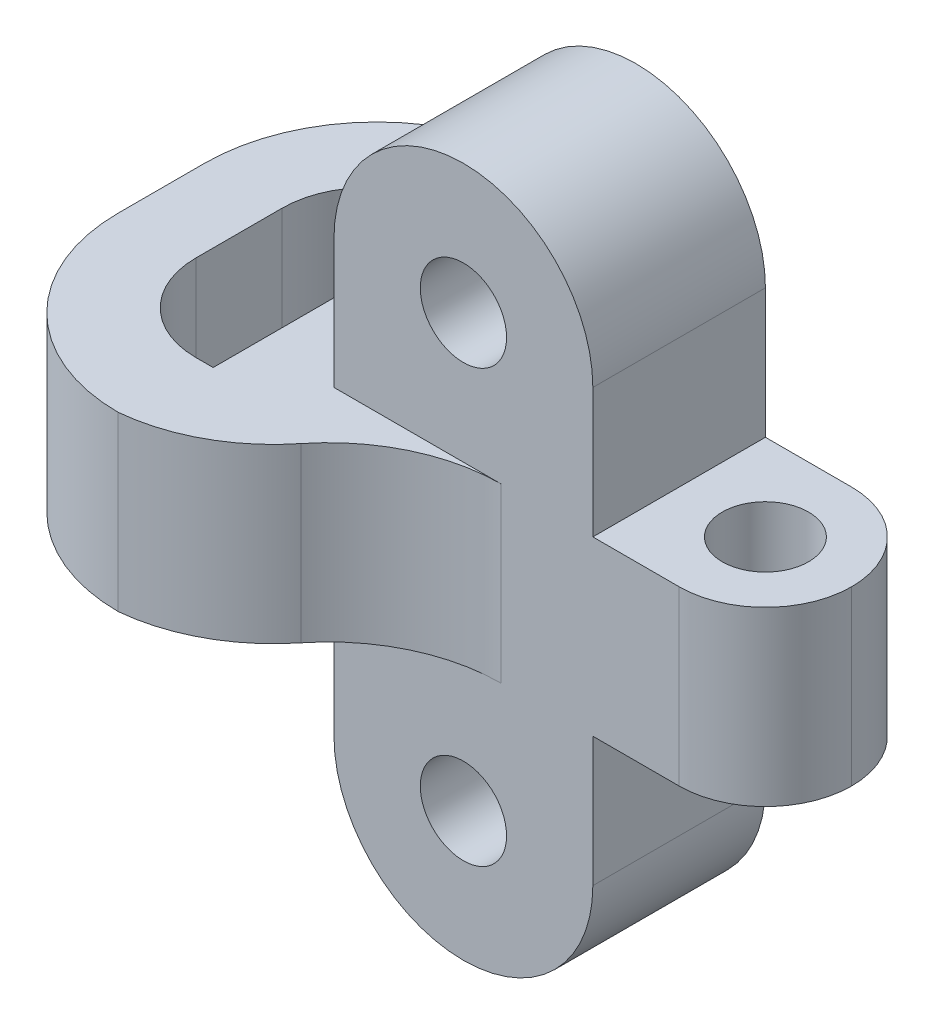
ISO-10303-21;
HEADER;
FILE_DESCRIPTION(('STEP AP214'),'2;1');
FILE_NAME('part.step','',(''),(''),'','','');
FILE_SCHEMA(('AUTOMOTIVE_DESIGN { 1 0 10303 214 1 1 1 1 }'));
ENDSEC;
DATA;
#1=APPLICATION_CONTEXT('core data for automotive mechanical design processes');
#2=APPLICATION_PROTOCOL_DEFINITION('international standard','automotive_design',2000,#1);
#3=PRODUCT_CONTEXT('',#1,'mechanical');
#4=PRODUCT('Part','Part','',(#3));
#5=PRODUCT_RELATED_PRODUCT_CATEGORY('part','',(#4));
#6=PRODUCT_DEFINITION_FORMATION('','',#4);
#7=PRODUCT_DEFINITION_CONTEXT('part definition',#1,'design');
#8=PRODUCT_DEFINITION('design','',#6,#7);
#9=PRODUCT_DEFINITION_SHAPE('','',#8);
#10=(LENGTH_UNIT() NAMED_UNIT(*) SI_UNIT(.MILLI.,.METRE.));
#11=(NAMED_UNIT(*) PLANE_ANGLE_UNIT() SI_UNIT($,.RADIAN.));
#12=(NAMED_UNIT(*) SI_UNIT($,.STERADIAN.) SOLID_ANGLE_UNIT());
#13=UNCERTAINTY_MEASURE_WITH_UNIT(LENGTH_MEASURE(1.E-05),#10,'distance_accuracy_value','');
#14=(GEOMETRIC_REPRESENTATION_CONTEXT(3) GLOBAL_UNCERTAINTY_ASSIGNED_CONTEXT((#13)) GLOBAL_UNIT_ASSIGNED_CONTEXT((#10,
#11,#12)) REPRESENTATION_CONTEXT('',''));
#15=CARTESIAN_POINT('',(0.,0.,0.));
#16=DIRECTION('',(0.,0.,1.));
#17=DIRECTION('',(1.,0.,0.));
#18=AXIS2_PLACEMENT_3D('',#15,#16,#17);
#19=CARTESIAN_POINT('',(7.5,0.,5.));
#20=DIRECTION('',(1.,0.,0.));
#21=DIRECTION('',(0.,0.,-1.));
#22=AXIS2_PLACEMENT_3D('',#19,#20,#21);
#23=PLANE('',#22);
#24=DIRECTION('',(0.,-1.,0.));
#25=VECTOR('',#24,1.);
#26=CARTESIAN_POINT('',(7.5,0.,5.));
#27=LINE('',#26,#25);
#28=CARTESIAN_POINT('',(7.5,25.,5.));
#29=VERTEX_POINT('',#28);
#30=CARTESIAN_POINT('',(7.5,17.5,5.));
#31=VERTEX_POINT('',#30);
#32=EDGE_CURVE('E226',#29,#31,#27,.T.);
#33=ORIENTED_EDGE('',*,*,#32,.T.);
#34=DIRECTION('',(0.,0.,1.));
#35=VECTOR('',#34,1.);
#36=CARTESIAN_POINT('',(7.5,17.5,5.));
#37=LINE('',#36,#35);
#38=CARTESIAN_POINT('',(7.5,17.5,-5.));
#39=VERTEX_POINT('',#38);
#40=EDGE_CURVE('E210',#39,#31,#37,.T.);
#41=ORIENTED_EDGE('',*,*,#40,.F.);
#42=DIRECTION('',(0.,-1.,0.));
#43=VECTOR('',#42,1.);
#44=CARTESIAN_POINT('',(7.5,0.,-5.));
#45=LINE('',#44,#43);
#46=CARTESIAN_POINT('',(7.5,25.,-5.));
#47=VERTEX_POINT('',#46);
#48=EDGE_CURVE('E224',#47,#39,#45,.T.);
#49=ORIENTED_EDGE('',*,*,#48,.F.);
#50=DIRECTION('',(0.,0.,-1.));
#51=VECTOR('',#50,1.);
#52=CARTESIAN_POINT('',(7.5,25.,5.));
#53=LINE('',#52,#51);
#54=EDGE_CURVE('E276',#29,#47,#53,.T.);
#55=ORIENTED_EDGE('',*,*,#54,.F.);
#56=EDGE_LOOP('',(#33,#41,#49,#55));
#57=FACE_BOUND('',#56,.T.);
#58=ADVANCED_FACE('F41',(#57),#23,.T.);
#59=CARTESIAN_POINT('',(7.5,7.5,-5.));
#60=VERTEX_POINT('',#59);
#61=CARTESIAN_POINT('',(7.5,0.,-5.));
#62=VERTEX_POINT('',#61);
#63=EDGE_CURVE('E236',#60,#62,#45,.T.);
#64=ORIENTED_EDGE('',*,*,#63,.F.);
#65=DIRECTION('',(0.,0.,-1.));
#66=VECTOR('',#65,1.);
#67=CARTESIAN_POINT('',(7.5,7.5,5.));
#68=LINE('',#67,#66);
#69=CARTESIAN_POINT('',(7.5,7.5,5.));
#70=VERTEX_POINT('',#69);
#71=EDGE_CURVE('E228',#70,#60,#68,.T.);
#72=ORIENTED_EDGE('',*,*,#71,.F.);
#73=CARTESIAN_POINT('',(7.5,0.,5.));
#74=VERTEX_POINT('',#73);
#75=EDGE_CURVE('E263',#70,#74,#27,.T.);
#76=ORIENTED_EDGE('',*,*,#75,.T.);
#77=DIRECTION('',(0.,0.,-1.));
#78=VECTOR('',#77,1.);
#79=CARTESIAN_POINT('',(7.5,0.,5.));
#80=LINE('',#79,#78);
#81=EDGE_CURVE('E264',#74,#62,#80,.T.);
#82=ORIENTED_EDGE('',*,*,#81,.T.);
#83=EDGE_LOOP('',(#64,#72,#76,#82));
#84=FACE_BOUND('',#83,.T.);
#85=ADVANCED_FACE('F455',(#84),#23,.T.);
#86=CARTESIAN_POINT('',(-7.5,0.,5.));
#87=DIRECTION('',(1.,0.,0.));
#88=DIRECTION('',(0.,0.,-1.));
#89=AXIS2_PLACEMENT_3D('',#86,#87,#88);
#90=PLANE('',#89);
#91=DIRECTION('',(0.,0.,-1.));
#92=VECTOR('',#91,1.);
#93=CARTESIAN_POINT('',(-7.5,17.5,-12.5));
#94=LINE('',#93,#92);
#95=CARTESIAN_POINT('',(-7.5,17.5,5.));
#96=VERTEX_POINT('',#95);
#97=CARTESIAN_POINT('',(-7.5,17.5,-5.));
#98=VERTEX_POINT('',#97);
#99=EDGE_CURVE('E464',#96,#98,#94,.T.);
#100=ORIENTED_EDGE('',*,*,#99,.F.);
#101=DIRECTION('',(0.,-1.,0.));
#102=VECTOR('',#101,1.);
#103=CARTESIAN_POINT('',(-7.5,0.,5.));
#104=LINE('',#103,#102);
#105=CARTESIAN_POINT('',(-7.5,25.,5.));
#106=VERTEX_POINT('',#105);
#107=EDGE_CURVE('E424',#106,#96,#104,.T.);
#108=ORIENTED_EDGE('',*,*,#107,.F.);
#109=DIRECTION('',(0.,0.,-1.));
#110=VECTOR('',#109,1.);
#111=CARTESIAN_POINT('',(-7.5,25.,5.));
#112=LINE('',#111,#110);
#113=CARTESIAN_POINT('',(-7.5,25.,-5.));
#114=VERTEX_POINT('',#113);
#115=EDGE_CURVE('E272',#106,#114,#112,.T.);
#116=ORIENTED_EDGE('',*,*,#115,.T.);
#117=DIRECTION('',(0.,-1.,0.));
#118=VECTOR('',#117,1.);
#119=CARTESIAN_POINT('',(-7.5,0.,-5.));
#120=LINE('',#119,#118);
#121=EDGE_CURVE('E247',#114,#98,#120,.T.);
#122=ORIENTED_EDGE('',*,*,#121,.T.);
#123=EDGE_LOOP('',(#100,#108,#116,#122));
#124=FACE_BOUND('',#123,.T.);
#125=ADVANCED_FACE('F540',(#124),#90,.F.);
#126=DIRECTION('',(0.,0.,1.));
#127=VECTOR('',#126,1.);
#128=CARTESIAN_POINT('',(-7.5,7.5,-12.5));
#129=LINE('',#128,#127);
#130=CARTESIAN_POINT('',(-7.5,7.5,-5.));
#131=VERTEX_POINT('',#130);
#132=CARTESIAN_POINT('',(-7.5,7.5,5.));
#133=VERTEX_POINT('',#132);
#134=EDGE_CURVE('E445',#131,#133,#129,.T.);
#135=ORIENTED_EDGE('',*,*,#134,.F.);
#136=CARTESIAN_POINT('',(-7.5,0.,-5.));
#137=VERTEX_POINT('',#136);
#138=EDGE_CURVE('E240',#131,#137,#120,.T.);
#139=ORIENTED_EDGE('',*,*,#138,.T.);
#140=DIRECTION('',(0.,0.,-1.));
#141=VECTOR('',#140,1.);
#142=CARTESIAN_POINT('',(-7.5,0.,5.));
#143=LINE('',#142,#141);
#144=CARTESIAN_POINT('',(-7.5,0.,5.));
#145=VERTEX_POINT('',#144);
#146=EDGE_CURVE('E268',#145,#137,#143,.T.);
#147=ORIENTED_EDGE('',*,*,#146,.F.);
#148=EDGE_CURVE('E428',#133,#145,#104,.T.);
#149=ORIENTED_EDGE('',*,*,#148,.F.);
#150=EDGE_LOOP('',(#135,#139,#147,#149));
#151=FACE_BOUND('',#150,.T.);
#152=ADVANCED_FACE('F441',(#151),#90,.F.);
#153=CARTESIAN_POINT('',(0.,25.,5.));
#154=DIRECTION('',(0.,0.,-1.));
#155=DIRECTION('',(-1.,0.,0.));
#156=AXIS2_PLACEMENT_3D('',#153,#154,#155);
#157=CYLINDRICAL_SURFACE('',#156,7.5);
#158=CARTESIAN_POINT('',(0.,25.,-5.));
#159=DIRECTION('',(0.,0.,1.));
#160=DIRECTION('',(1.,0.,0.));
#161=AXIS2_PLACEMENT_3D('',#158,#159,#160);
#162=CIRCLE('',#161,7.5);
#163=EDGE_CURVE('E234',#47,#114,#162,.T.);
#164=ORIENTED_EDGE('',*,*,#163,.T.);
#165=ORIENTED_EDGE('',*,*,#115,.F.);
#166=CARTESIAN_POINT('',(0.,25.,5.));
#167=DIRECTION('',(0.,0.,1.));
#168=DIRECTION('',(1.,0.,0.));
#169=AXIS2_PLACEMENT_3D('',#166,#167,#168);
#170=CIRCLE('',#169,7.5);
#171=EDGE_CURVE('E431',#29,#106,#170,.T.);
#172=ORIENTED_EDGE('',*,*,#171,.F.);
#173=ORIENTED_EDGE('',*,*,#54,.T.);
#174=EDGE_LOOP('',(#164,#165,#172,#173));
#175=FACE_BOUND('',#174,.T.);
#176=ADVANCED_FACE('F543',(#175),#157,.T.);
#177=CARTESIAN_POINT('',(0.,25.,5.));
#178=DIRECTION('',(0.,0.,-1.));
#179=DIRECTION('',(-1.,0.,0.));
#180=AXIS2_PLACEMENT_3D('',#177,#178,#179);
#181=CYLINDRICAL_SURFACE('',#180,2.5);
#182=CARTESIAN_POINT('',(0.,25.,5.));
#183=DIRECTION('',(0.,0.,1.));
#184=DIRECTION('',(1.,0.,0.));
#185=AXIS2_PLACEMENT_3D('',#182,#183,#184);
#186=CIRCLE('',#185,2.5);
#187=CARTESIAN_POINT('',(2.5,25.,5.));
#188=VERTEX_POINT('',#187);
#189=EDGE_CURVE('E418',#188,#188,#186,.T.);
#190=ORIENTED_EDGE('',*,*,#189,.T.);
#191=EDGE_LOOP('',(#190));
#192=FACE_BOUND('',#191,.T.);
#193=CARTESIAN_POINT('',(0.,25.,-5.));
#194=DIRECTION('',(0.,0.,1.));
#195=DIRECTION('',(1.,0.,0.));
#196=AXIS2_PLACEMENT_3D('',#193,#194,#195);
#197=CIRCLE('',#196,2.5);
#198=CARTESIAN_POINT('',(2.5,25.,-5.));
#199=VERTEX_POINT('',#198);
#200=EDGE_CURVE('E255',#199,#199,#197,.T.);
#201=ORIENTED_EDGE('',*,*,#200,.F.);
#202=EDGE_LOOP('',(#201));
#203=FACE_BOUND('',#202,.T.);
#204=ADVANCED_FACE('F790',(#192,#203),#181,.F.);
#205=CARTESIAN_POINT('',(0.,0.,5.));
#206=DIRECTION('',(0.,0.,-1.));
#207=DIRECTION('',(-1.,0.,0.));
#208=AXIS2_PLACEMENT_3D('',#205,#206,#207);
#209=CYLINDRICAL_SURFACE('',#208,7.5);
#210=CARTESIAN_POINT('',(0.,0.,-5.));
#211=DIRECTION('',(0.,0.,1.));
#212=DIRECTION('',(1.,0.,0.));
#213=AXIS2_PLACEMENT_3D('',#210,#211,#212);
#214=CIRCLE('',#213,7.5);
#215=EDGE_CURVE('E251',#137,#62,#214,.T.);
#216=ORIENTED_EDGE('',*,*,#215,.T.);
#217=ORIENTED_EDGE('',*,*,#81,.F.);
#218=CARTESIAN_POINT('',(0.,0.,5.));
#219=DIRECTION('',(0.,0.,1.));
#220=DIRECTION('',(1.,0.,0.));
#221=AXIS2_PLACEMENT_3D('',#218,#219,#220);
#222=CIRCLE('',#221,7.5);
#223=EDGE_CURVE('E421',#145,#74,#222,.T.);
#224=ORIENTED_EDGE('',*,*,#223,.F.);
#225=ORIENTED_EDGE('',*,*,#146,.T.);
#226=EDGE_LOOP('',(#216,#217,#224,#225));
#227=FACE_BOUND('',#226,.T.);
#228=ADVANCED_FACE('F448',(#227),#209,.T.);
#229=CARTESIAN_POINT('',(0.,0.,5.));
#230=DIRECTION('',(0.,0.,-1.));
#231=DIRECTION('',(-1.,0.,0.));
#232=AXIS2_PLACEMENT_3D('',#229,#230,#231);
#233=CYLINDRICAL_SURFACE('',#232,2.5);
#234=CARTESIAN_POINT('',(0.,0.,5.));
#235=DIRECTION('',(0.,0.,1.));
#236=DIRECTION('',(1.,0.,0.));
#237=AXIS2_PLACEMENT_3D('',#234,#235,#236);
#238=CIRCLE('',#237,2.5);
#239=CARTESIAN_POINT('',(2.5,0.,5.));
#240=VERTEX_POINT('',#239);
#241=EDGE_CURVE('E244',#240,#240,#238,.T.);
#242=ORIENTED_EDGE('',*,*,#241,.T.);
#243=EDGE_LOOP('',(#242));
#244=FACE_BOUND('',#243,.T.);
#245=CARTESIAN_POINT('',(0.,0.,-5.));
#246=DIRECTION('',(0.,0.,1.));
#247=DIRECTION('',(1.,0.,0.));
#248=AXIS2_PLACEMENT_3D('',#245,#246,#247);
#249=CIRCLE('',#248,2.5);
#250=CARTESIAN_POINT('',(2.5,0.,-5.));
#251=VERTEX_POINT('',#250);
#252=EDGE_CURVE('E259',#251,#251,#249,.T.);
#253=ORIENTED_EDGE('',*,*,#252,.F.);
#254=EDGE_LOOP('',(#253));
#255=FACE_BOUND('',#254,.T.);
#256=ADVANCED_FACE('F625',(#244,#255),#233,.F.);
#257=CARTESIAN_POINT('',(0.,0.,5.));
#258=DIRECTION('',(0.,0.,1.));
#259=DIRECTION('',(1.,0.,0.));
#260=AXIS2_PLACEMENT_3D('',#257,#258,#259);
#261=PLANE('',#260);
#262=DIRECTION('',(-1.,0.,0.));
#263=VECTOR('',#262,1.);
#264=CARTESIAN_POINT('',(17.5,7.5,5.));
#265=LINE('',#264,#263);
#266=CARTESIAN_POINT('',(12.5,7.5,5.));
#267=VERTEX_POINT('',#266);
#268=EDGE_CURVE('E499',#267,#70,#265,.T.);
#269=ORIENTED_EDGE('',*,*,#268,.F.);
#270=DIRECTION('',(0.,-1.,0.));
#271=VECTOR('',#270,1.);
#272=CARTESIAN_POINT('',(12.5,17.5,5.));
#273=LINE('',#272,#271);
#274=CARTESIAN_POINT('',(12.5,17.5,5.));
#275=VERTEX_POINT('',#274);
#276=EDGE_CURVE('E11',#267,#275,#273,.F.);
#277=ORIENTED_EDGE('',*,*,#276,.T.);
#278=DIRECTION('',(-1.,0.,0.));
#279=VECTOR('',#278,1.);
#280=CARTESIAN_POINT('',(17.5,17.5,5.));
#281=LINE('',#280,#279);
#282=EDGE_CURVE('E220',#275,#31,#281,.T.);
#283=ORIENTED_EDGE('',*,*,#282,.T.);
#284=ORIENTED_EDGE('',*,*,#32,.F.);
#285=ORIENTED_EDGE('',*,*,#171,.T.);
#286=ORIENTED_EDGE('',*,*,#107,.T.);
#287=DIRECTION('',(1.,0.,0.));
#288=VECTOR('',#287,1.);
#289=CARTESIAN_POINT('',(0.,17.5,5.));
#290=LINE('',#289,#288);
#291=CARTESIAN_POINT('',(2.18245836551854,17.5,5.));
#292=VERTEX_POINT('',#291);
#293=EDGE_CURVE('E342',#96,#292,#290,.T.);
#294=ORIENTED_EDGE('',*,*,#293,.T.);
#295=DIRECTION('',(0.,-1.,0.));
#296=VECTOR('',#295,1.);
#297=CARTESIAN_POINT('',(2.18245836551854,7.5,5.));
#298=LINE('',#297,#296);
#299=CARTESIAN_POINT('',(2.18245836551854,7.5,5.));
#300=VERTEX_POINT('',#299);
#301=EDGE_CURVE('E338',#292,#300,#298,.T.);
#302=ORIENTED_EDGE('',*,*,#301,.T.);
#303=DIRECTION('',(-1.,0.,0.));
#304=VECTOR('',#303,1.);
#305=CARTESIAN_POINT('',(0.,7.5,5.));
#306=LINE('',#305,#304);
#307=EDGE_CURVE('E335',#300,#133,#306,.T.);
#308=ORIENTED_EDGE('',*,*,#307,.T.);
#309=ORIENTED_EDGE('',*,*,#148,.T.);
#310=ORIENTED_EDGE('',*,*,#223,.T.);
#311=ORIENTED_EDGE('',*,*,#75,.F.);
#312=EDGE_LOOP('',(#269,#277,#283,#284,#285,#286,#294,#302,#308,#309,#310,#311));
#313=FACE_BOUND('',#312,.T.);
#314=ORIENTED_EDGE('',*,*,#189,.F.);
#315=EDGE_LOOP('',(#314));
#316=FACE_BOUND('',#315,.T.);
#317=ORIENTED_EDGE('',*,*,#241,.F.);
#318=EDGE_LOOP('',(#317));
#319=FACE_BOUND('',#318,.T.);
#320=ADVANCED_FACE('F458',(#313,#316,#319),#261,.T.);
#321=CARTESIAN_POINT('',(0.,0.,-5.));
#322=DIRECTION('',(0.,0.,1.));
#323=DIRECTION('',(1.,0.,0.));
#324=AXIS2_PLACEMENT_3D('',#321,#322,#323);
#325=PLANE('',#324);
#326=DIRECTION('',(-1.,0.,0.));
#327=VECTOR('',#326,1.);
#328=CARTESIAN_POINT('',(17.5,17.5,-5.));
#329=LINE('',#328,#327);
#330=CARTESIAN_POINT('',(12.5,17.5,-5.));
#331=VERTEX_POINT('',#330);
#332=EDGE_CURVE('E206',#331,#39,#329,.T.);
#333=ORIENTED_EDGE('',*,*,#332,.F.);
#334=DIRECTION('',(0.,1.,0.));
#335=VECTOR('',#334,1.);
#336=CARTESIAN_POINT('',(12.5,0.,-5.));
#337=LINE('',#336,#335);
#338=CARTESIAN_POINT('',(12.5,7.5,-5.));
#339=VERTEX_POINT('',#338);
#340=EDGE_CURVE('E409',#331,#339,#337,.F.);
#341=ORIENTED_EDGE('',*,*,#340,.T.);
#342=DIRECTION('',(-1.,0.,0.));
#343=VECTOR('',#342,1.);
#344=CARTESIAN_POINT('',(17.5,7.5,-5.));
#345=LINE('',#344,#343);
#346=EDGE_CURVE('E451',#339,#60,#345,.T.);
#347=ORIENTED_EDGE('',*,*,#346,.T.);
#348=ORIENTED_EDGE('',*,*,#63,.T.);
#349=ORIENTED_EDGE('',*,*,#215,.F.);
#350=ORIENTED_EDGE('',*,*,#138,.F.);
#351=DIRECTION('',(1.,0.,0.));
#352=VECTOR('',#351,1.);
#353=CARTESIAN_POINT('',(-22.5,7.5,-5.));
#354=LINE('',#353,#352);
#355=CARTESIAN_POINT('',(2.18245836551854,7.5,-5.));
#356=VERTEX_POINT('',#355);
#357=EDGE_CURVE('E331',#131,#356,#354,.T.);
#358=ORIENTED_EDGE('',*,*,#357,.T.);
#359=DIRECTION('',(0.,-1.,0.));
#360=VECTOR('',#359,1.);
#361=CARTESIAN_POINT('',(2.18245836551854,0.,-5.));
#362=LINE('',#361,#360);
#363=CARTESIAN_POINT('',(2.18245836551854,17.5,-5.));
#364=VERTEX_POINT('',#363);
#365=EDGE_CURVE('E327',#356,#364,#362,.F.);
#366=ORIENTED_EDGE('',*,*,#365,.T.);
#367=DIRECTION('',(-1.,0.,0.));
#368=VECTOR('',#367,1.);
#369=CARTESIAN_POINT('',(-22.5,17.5,-5.));
#370=LINE('',#369,#368);
#371=EDGE_CURVE('E324',#364,#98,#370,.T.);
#372=ORIENTED_EDGE('',*,*,#371,.T.);
#373=ORIENTED_EDGE('',*,*,#121,.F.);
#374=ORIENTED_EDGE('',*,*,#163,.F.);
#375=ORIENTED_EDGE('',*,*,#48,.T.);
#376=EDGE_LOOP('',(#333,#341,#347,#348,#349,#350,#358,#366,#372,#373,#374,#375));
#377=FACE_BOUND('',#376,.T.);
#378=ORIENTED_EDGE('',*,*,#200,.T.);
#379=EDGE_LOOP('',(#378));
#380=FACE_BOUND('',#379,.T.);
#381=ORIENTED_EDGE('',*,*,#252,.T.);
#382=EDGE_LOOP('',(#381));
#383=FACE_BOUND('',#382,.T.);
#384=ADVANCED_FACE('F231',(#377,#380,#383),#325,.F.);
#385=CARTESIAN_POINT('',(-22.5,17.5,-12.5));
#386=DIRECTION('',(0.,-1.,0.));
#387=DIRECTION('',(0.,0.,-1.));
#388=AXIS2_PLACEMENT_3D('',#385,#386,#387);
#389=PLANE('',#388);
#390=DIRECTION('',(-1.,0.,0.));
#391=VECTOR('',#390,1.);
#392=CARTESIAN_POINT('',(-18.,17.5,-7.5));
#393=LINE('',#392,#391);
#394=CARTESIAN_POINT('',(-12.,17.5,-7.5));
#395=VERTEX_POINT('',#394);
#396=CARTESIAN_POINT('',(-13.,17.5,-7.5));
#397=VERTEX_POINT('',#396);
#398=EDGE_CURVE('E491',#395,#397,#393,.T.);
#399=ORIENTED_EDGE('',*,*,#398,.F.);
#400=DIRECTION('',(0.,0.,-1.));
#401=VECTOR('',#400,1.);
#402=CARTESIAN_POINT('',(-12.,17.5,7.5));
#403=LINE('',#402,#401);
#404=CARTESIAN_POINT('',(-12.,17.5,7.5));
#405=VERTEX_POINT('',#404);
#406=EDGE_CURVE('E219',#405,#395,#403,.T.);
#407=ORIENTED_EDGE('',*,*,#406,.F.);
#408=DIRECTION('',(1.,0.,0.));
#409=VECTOR('',#408,1.);
#410=CARTESIAN_POINT('',(-18.,17.5,7.5));
#411=LINE('',#410,#409);
#412=CARTESIAN_POINT('',(-13.,17.5,7.5));
#413=VERTEX_POINT('',#412);
#414=EDGE_CURVE('E481',#413,#405,#411,.T.);
#415=ORIENTED_EDGE('',*,*,#414,.F.);
#416=CARTESIAN_POINT('',(-13.,17.5,2.5));
#417=DIRECTION('',(0.,-1.,0.));
#418=DIRECTION('',(0.,0.,-1.));
#419=AXIS2_PLACEMENT_3D('',#416,#417,#418);
#420=CIRCLE('',#419,5.);
#421=CARTESIAN_POINT('',(-18.,17.5,2.5));
#422=VERTEX_POINT('',#421);
#423=EDGE_CURVE('E392',#413,#422,#420,.T.);
#424=ORIENTED_EDGE('',*,*,#423,.T.);
#425=DIRECTION('',(0.,0.,1.));
#426=VECTOR('',#425,1.);
#427=CARTESIAN_POINT('',(-18.,17.5,7.5));
#428=LINE('',#427,#426);
#429=CARTESIAN_POINT('',(-18.,17.5,-2.5));
#430=VERTEX_POINT('',#429);
#431=EDGE_CURVE('E487',#430,#422,#428,.T.);
#432=ORIENTED_EDGE('',*,*,#431,.F.);
#433=CARTESIAN_POINT('',(-13.,17.5,-2.5));
#434=DIRECTION('',(0.,-1.,0.));
#435=DIRECTION('',(0.,0.,-1.));
#436=AXIS2_PLACEMENT_3D('',#433,#434,#435);
#437=CIRCLE('',#436,5.);
#438=EDGE_CURVE('E398',#430,#397,#437,.T.);
#439=ORIENTED_EDGE('',*,*,#438,.T.);
#440=EDGE_LOOP('',(#399,#407,#415,#424,#432,#439));
#441=FACE_BOUND('',#440,.T.);
#442=CARTESIAN_POINT('',(2.18245836551854,17.5,-15.));
#443=DIRECTION('',(0.,-1.,0.));
#444=DIRECTION('',(0.,0.,-1.));
#445=AXIS2_PLACEMENT_3D('',#442,#443,#444);
#446=CIRCLE('',#445,10.);
#447=CARTESIAN_POINT('',(-5.64251083891436,17.5,-8.77345545670179));
#448=VERTEX_POINT('',#447);
#449=EDGE_CURVE('E349',#364,#448,#446,.T.);
#450=ORIENTED_EDGE('',*,*,#449,.T.);
#451=CARTESIAN_POINT('',(-13.4674800433473,17.5,-2.54691091340358));
#452=DIRECTION('',(0.,-1.,0.));
#453=DIRECTION('',(0.,0.,-1.));
#454=AXIS2_PLACEMENT_3D('',#451,#452,#453);
#455=CIRCLE('',#454,10.);
#456=CARTESIAN_POINT('',(-12.5,17.5,-12.5));
#457=VERTEX_POINT('',#456);
#458=EDGE_CURVE('E372',#448,#457,#455,.F.);
#459=ORIENTED_EDGE('',*,*,#458,.T.);
#460=CARTESIAN_POINT('',(-12.5,17.5,-2.5));
#461=DIRECTION('',(0.,-1.,0.));
#462=DIRECTION('',(0.,0.,-1.));
#463=AXIS2_PLACEMENT_3D('',#460,#461,#462);
#464=CIRCLE('',#463,10.);
#465=CARTESIAN_POINT('',(-22.5,17.5,-2.5));
#466=VERTEX_POINT('',#465);
#467=EDGE_CURVE('E302',#457,#466,#464,.F.);
#468=ORIENTED_EDGE('',*,*,#467,.T.);
#469=DIRECTION('',(0.,0.,-1.));
#470=VECTOR('',#469,1.);
#471=CARTESIAN_POINT('',(-22.5,17.5,-12.5));
#472=LINE('',#471,#470);
#473=CARTESIAN_POINT('',(-22.5,17.5,2.5));
#474=VERTEX_POINT('',#473);
#475=EDGE_CURVE('E463',#474,#466,#472,.T.);
#476=ORIENTED_EDGE('',*,*,#475,.F.);
#477=CARTESIAN_POINT('',(-12.5,17.5,2.5));
#478=DIRECTION('',(0.,-1.,0.));
#479=DIRECTION('',(0.,0.,-1.));
#480=AXIS2_PLACEMENT_3D('',#477,#478,#479);
#481=CIRCLE('',#480,10.);
#482=CARTESIAN_POINT('',(-12.5,17.5,12.5));
#483=VERTEX_POINT('',#482);
#484=EDGE_CURVE('E305',#474,#483,#481,.F.);
#485=ORIENTED_EDGE('',*,*,#484,.T.);
#486=CARTESIAN_POINT('',(-13.4674800433473,17.5,2.54691091340358));
#487=DIRECTION('',(0.,-1.,0.));
#488=DIRECTION('',(0.,0.,-1.));
#489=AXIS2_PLACEMENT_3D('',#486,#487,#488);
#490=CIRCLE('',#489,10.);
#491=CARTESIAN_POINT('',(-5.64251083891436,17.5,8.77345545670179));
#492=VERTEX_POINT('',#491);
#493=EDGE_CURVE('E369',#483,#492,#490,.F.);
#494=ORIENTED_EDGE('',*,*,#493,.T.);
#495=CARTESIAN_POINT('',(2.18245836551854,17.5,15.));
#496=DIRECTION('',(0.,-1.,0.));
#497=DIRECTION('',(0.,0.,-1.));
#498=AXIS2_PLACEMENT_3D('',#495,#496,#497);
#499=CIRCLE('',#498,10.);
#500=EDGE_CURVE('E353',#492,#292,#499,.T.);
#501=ORIENTED_EDGE('',*,*,#500,.T.);
#502=ORIENTED_EDGE('',*,*,#293,.F.);
#503=ORIENTED_EDGE('',*,*,#99,.T.);
#504=ORIENTED_EDGE('',*,*,#371,.F.);
#505=EDGE_LOOP('',(#450,#459,#468,#476,#485,#494,#501,#502,#503,#504));
#506=FACE_BOUND('',#505,.T.);
#507=ADVANCED_FACE('F615',(#441,#506),#389,.F.);
#508=CARTESIAN_POINT('',(-22.5,7.5,-12.5));
#509=DIRECTION('',(0.,1.,0.));
#510=DIRECTION('',(0.,0.,1.));
#511=AXIS2_PLACEMENT_3D('',#508,#509,#510);
#512=PLANE('',#511);
#513=DIRECTION('',(0.,0.,1.));
#514=VECTOR('',#513,1.);
#515=CARTESIAN_POINT('',(-18.,7.5,-12.5));
#516=LINE('',#515,#514);
#517=CARTESIAN_POINT('',(-18.,7.5,-2.5));
#518=VERTEX_POINT('',#517);
#519=CARTESIAN_POINT('',(-18.,7.5,2.5));
#520=VERTEX_POINT('',#519);
#521=EDGE_CURVE('E283',#518,#520,#516,.T.);
#522=ORIENTED_EDGE('',*,*,#521,.T.);
#523=CARTESIAN_POINT('',(-13.,7.5,2.5));
#524=DIRECTION('',(0.,1.,0.));
#525=DIRECTION('',(0.,0.,1.));
#526=AXIS2_PLACEMENT_3D('',#523,#524,#525);
#527=CIRCLE('',#526,5.);
#528=CARTESIAN_POINT('',(-13.,7.5,7.5));
#529=VERTEX_POINT('',#528);
#530=EDGE_CURVE('E395',#520,#529,#527,.T.);
#531=ORIENTED_EDGE('',*,*,#530,.T.);
#532=DIRECTION('',(1.,0.,0.));
#533=VECTOR('',#532,1.);
#534=CARTESIAN_POINT('',(-22.5,7.5,7.5));
#535=LINE('',#534,#533);
#536=CARTESIAN_POINT('',(-12.,7.5,7.5));
#537=VERTEX_POINT('',#536);
#538=EDGE_CURVE('E287',#529,#537,#535,.T.);
#539=ORIENTED_EDGE('',*,*,#538,.T.);
#540=DIRECTION('',(0.,0.,-1.));
#541=VECTOR('',#540,1.);
#542=CARTESIAN_POINT('',(-12.,7.5,-12.5));
#543=LINE('',#542,#541);
#544=CARTESIAN_POINT('',(-12.,7.5,-7.5));
#545=VERTEX_POINT('',#544);
#546=EDGE_CURVE('E290',#537,#545,#543,.T.);
#547=ORIENTED_EDGE('',*,*,#546,.T.);
#548=DIRECTION('',(-1.,0.,0.));
#549=VECTOR('',#548,1.);
#550=CARTESIAN_POINT('',(-22.5,7.5,-7.5));
#551=LINE('',#550,#549);
#552=CARTESIAN_POINT('',(-13.,7.5,-7.5));
#553=VERTEX_POINT('',#552);
#554=EDGE_CURVE('E279',#545,#553,#551,.T.);
#555=ORIENTED_EDGE('',*,*,#554,.T.);
#556=CARTESIAN_POINT('',(-13.,7.5,-2.5));
#557=DIRECTION('',(0.,1.,0.));
#558=DIRECTION('',(0.,0.,1.));
#559=AXIS2_PLACEMENT_3D('',#556,#557,#558);
#560=CIRCLE('',#559,5.);
#561=EDGE_CURVE('E401',#553,#518,#560,.T.);
#562=ORIENTED_EDGE('',*,*,#561,.T.);
#563=EDGE_LOOP('',(#522,#531,#539,#547,#555,#562));
#564=FACE_BOUND('',#563,.T.);
#565=CARTESIAN_POINT('',(-12.5,7.5,-2.5));
#566=DIRECTION('',(0.,1.,0.));
#567=DIRECTION('',(0.,0.,1.));
#568=AXIS2_PLACEMENT_3D('',#565,#566,#567);
#569=CIRCLE('',#568,10.);
#570=CARTESIAN_POINT('',(-22.5,7.5,-2.5));
#571=VERTEX_POINT('',#570);
#572=CARTESIAN_POINT('',(-12.5,7.5,-12.5));
#573=VERTEX_POINT('',#572);
#574=EDGE_CURVE('E313',#571,#573,#569,.F.);
#575=ORIENTED_EDGE('',*,*,#574,.T.);
#576=CARTESIAN_POINT('',(-13.4674800433473,7.5,-2.54691091340358));
#577=DIRECTION('',(0.,1.,0.));
#578=DIRECTION('',(0.,0.,1.));
#579=AXIS2_PLACEMENT_3D('',#576,#577,#578);
#580=CIRCLE('',#579,10.);
#581=CARTESIAN_POINT('',(-5.64251083891436,7.5,-8.77345545670179));
#582=VERTEX_POINT('',#581);
#583=EDGE_CURVE('E363',#573,#582,#580,.F.);
#584=ORIENTED_EDGE('',*,*,#583,.T.);
#585=CARTESIAN_POINT('',(2.18245836551854,7.5,-15.));
#586=DIRECTION('',(0.,1.,0.));
#587=DIRECTION('',(0.,0.,1.));
#588=AXIS2_PLACEMENT_3D('',#585,#586,#587);
#589=CIRCLE('',#588,10.);
#590=EDGE_CURVE('E346',#582,#356,#589,.T.);
#591=ORIENTED_EDGE('',*,*,#590,.T.);
#592=ORIENTED_EDGE('',*,*,#357,.F.);
#593=ORIENTED_EDGE('',*,*,#134,.T.);
#594=ORIENTED_EDGE('',*,*,#307,.F.);
#595=CARTESIAN_POINT('',(2.18245836551854,7.5,15.));
#596=DIRECTION('',(0.,1.,0.));
#597=DIRECTION('',(0.,0.,1.));
#598=AXIS2_PLACEMENT_3D('',#595,#596,#597);
#599=CIRCLE('',#598,10.);
#600=CARTESIAN_POINT('',(-5.64251083891436,7.5,8.77345545670179));
#601=VERTEX_POINT('',#600);
#602=EDGE_CURVE('E356',#300,#601,#599,.T.);
#603=ORIENTED_EDGE('',*,*,#602,.T.);
#604=CARTESIAN_POINT('',(-13.4674800433473,7.5,2.54691091340358));
#605=DIRECTION('',(0.,1.,0.));
#606=DIRECTION('',(0.,0.,1.));
#607=AXIS2_PLACEMENT_3D('',#604,#605,#606);
#608=CIRCLE('',#607,10.);
#609=CARTESIAN_POINT('',(-12.5,7.5,12.5));
#610=VERTEX_POINT('',#609);
#611=EDGE_CURVE('E360',#601,#610,#608,.F.);
#612=ORIENTED_EDGE('',*,*,#611,.T.);
#613=CARTESIAN_POINT('',(-12.5,7.5,2.5));
#614=DIRECTION('',(0.,1.,0.));
#615=DIRECTION('',(0.,0.,1.));
#616=AXIS2_PLACEMENT_3D('',#613,#614,#615);
#617=CIRCLE('',#616,10.);
#618=CARTESIAN_POINT('',(-22.5,7.5,2.5));
#619=VERTEX_POINT('',#618);
#620=EDGE_CURVE('E317',#610,#619,#617,.F.);
#621=ORIENTED_EDGE('',*,*,#620,.T.);
#622=DIRECTION('',(0.,0.,1.));
#623=VECTOR('',#622,1.);
#624=CARTESIAN_POINT('',(-22.5,7.5,-12.5));
#625=LINE('',#624,#623);
#626=EDGE_CURVE('E242',#571,#619,#625,.T.);
#627=ORIENTED_EDGE('',*,*,#626,.F.);
#628=EDGE_LOOP('',(#575,#584,#591,#592,#593,#594,#603,#612,#621,#627));
#629=FACE_BOUND('',#628,.T.);
#630=ADVANCED_FACE('F461',(#564,#629),#512,.F.);
#631=CARTESIAN_POINT('',(-22.5,0.,0.));
#632=DIRECTION('',(1.,0.,0.));
#633=DIRECTION('',(0.,0.,-1.));
#634=AXIS2_PLACEMENT_3D('',#631,#632,#633);
#635=PLANE('',#634);
#636=ORIENTED_EDGE('',*,*,#626,.T.);
#637=DIRECTION('',(0.,1.,0.));
#638=VECTOR('',#637,1.);
#639=CARTESIAN_POINT('',(-22.5,0.,2.5));
#640=LINE('',#639,#638);
#641=EDGE_CURVE('E298',#619,#474,#640,.T.);
#642=ORIENTED_EDGE('',*,*,#641,.T.);
#643=ORIENTED_EDGE('',*,*,#475,.T.);
#644=DIRECTION('',(0.,-1.,0.));
#645=VECTOR('',#644,1.);
#646=CARTESIAN_POINT('',(-22.5,0.,-2.5));
#647=LINE('',#646,#645);
#648=EDGE_CURVE('E294',#466,#571,#647,.T.);
#649=ORIENTED_EDGE('',*,*,#648,.T.);
#650=EDGE_LOOP('',(#636,#642,#643,#649));
#651=FACE_BOUND('',#650,.T.);
#652=ADVANCED_FACE('F717',(#651),#635,.F.);
#653=CARTESIAN_POINT('',(-12.,2.5,7.5));
#654=DIRECTION('',(1.,0.,0.));
#655=DIRECTION('',(0.,0.,-1.));
#656=AXIS2_PLACEMENT_3D('',#653,#654,#655);
#657=PLANE('',#656);
#658=DIRECTION('',(0.,1.,0.));
#659=VECTOR('',#658,1.);
#660=CARTESIAN_POINT('',(-12.,2.5,7.5));
#661=LINE('',#660,#659);
#662=EDGE_CURVE('E471',#537,#405,#661,.T.);
#663=ORIENTED_EDGE('',*,*,#662,.T.);
#664=ORIENTED_EDGE('',*,*,#406,.T.);
#665=DIRECTION('',(0.,1.,0.));
#666=VECTOR('',#665,1.);
#667=CARTESIAN_POINT('',(-12.,2.5,-7.5));
#668=LINE('',#667,#666);
#669=EDGE_CURVE('E477',#545,#395,#668,.T.);
#670=ORIENTED_EDGE('',*,*,#669,.F.);
#671=ORIENTED_EDGE('',*,*,#546,.F.);
#672=EDGE_LOOP('',(#663,#664,#670,#671));
#673=FACE_BOUND('',#672,.T.);
#674=ADVANCED_FACE('F707',(#673),#657,.F.);
#675=CARTESIAN_POINT('',(-18.,2.5,7.5));
#676=DIRECTION('',(0.,0.,1.));
#677=DIRECTION('',(1.,0.,0.));
#678=AXIS2_PLACEMENT_3D('',#675,#676,#677);
#679=PLANE('',#678);
#680=ORIENTED_EDGE('',*,*,#538,.F.);
#681=DIRECTION('',(0.,1.,0.));
#682=VECTOR('',#681,1.);
#683=CARTESIAN_POINT('',(-13.,17.5,7.5));
#684=LINE('',#683,#682);
#685=EDGE_CURVE('E378',#529,#413,#684,.T.);
#686=ORIENTED_EDGE('',*,*,#685,.T.);
#687=ORIENTED_EDGE('',*,*,#414,.T.);
#688=ORIENTED_EDGE('',*,*,#662,.F.);
#689=EDGE_LOOP('',(#680,#686,#687,#688));
#690=FACE_BOUND('',#689,.T.);
#691=ADVANCED_FACE('F698',(#690),#679,.F.);
#692=CARTESIAN_POINT('',(-18.,2.5,7.5));
#693=DIRECTION('',(-1.,0.,0.));
#694=DIRECTION('',(0.,0.,1.));
#695=AXIS2_PLACEMENT_3D('',#692,#693,#694);
#696=PLANE('',#695);
#697=ORIENTED_EDGE('',*,*,#431,.T.);
#698=DIRECTION('',(0.,1.,0.));
#699=VECTOR('',#698,1.);
#700=CARTESIAN_POINT('',(-18.,7.5,2.5));
#701=LINE('',#700,#699);
#702=EDGE_CURVE('E386',#422,#520,#701,.F.);
#703=ORIENTED_EDGE('',*,*,#702,.T.);
#704=ORIENTED_EDGE('',*,*,#521,.F.);
#705=DIRECTION('',(0.,1.,0.));
#706=VECTOR('',#705,1.);
#707=CARTESIAN_POINT('',(-18.,17.5,-2.5));
#708=LINE('',#707,#706);
#709=EDGE_CURVE('E382',#518,#430,#708,.T.);
#710=ORIENTED_EDGE('',*,*,#709,.T.);
#711=EDGE_LOOP('',(#697,#703,#704,#710));
#712=FACE_BOUND('',#711,.T.);
#713=ADVANCED_FACE('F689',(#712),#696,.F.);
#714=CARTESIAN_POINT('',(-18.,2.5,-7.5));
#715=DIRECTION('',(0.,0.,-1.));
#716=DIRECTION('',(-1.,0.,0.));
#717=AXIS2_PLACEMENT_3D('',#714,#715,#716);
#718=PLANE('',#717);
#719=ORIENTED_EDGE('',*,*,#398,.T.);
#720=DIRECTION('',(0.,1.,0.));
#721=VECTOR('',#720,1.);
#722=CARTESIAN_POINT('',(-13.,7.5,-7.5));
#723=LINE('',#722,#721);
#724=EDGE_CURVE('E389',#397,#553,#723,.F.);
#725=ORIENTED_EDGE('',*,*,#724,.T.);
#726=ORIENTED_EDGE('',*,*,#554,.F.);
#727=ORIENTED_EDGE('',*,*,#669,.T.);
#728=EDGE_LOOP('',(#719,#725,#726,#727));
#729=FACE_BOUND('',#728,.T.);
#730=ADVANCED_FACE('F549',(#729),#718,.F.);
#731=CARTESIAN_POINT('',(-12.5,0.,2.5));
#732=DIRECTION('',(0.,1.,0.));
#733=DIRECTION('',(0.,0.,1.));
#734=AXIS2_PLACEMENT_3D('',#731,#732,#733);
#735=CYLINDRICAL_SURFACE('',#734,10.);
#736=ORIENTED_EDGE('',*,*,#620,.F.);
#737=DIRECTION('',(0.,1.,0.));
#738=VECTOR('',#737,1.);
#739=CARTESIAN_POINT('',(-12.5,7.5,12.5));
#740=LINE('',#739,#738);
#741=EDGE_CURVE('E309',#483,#610,#740,.F.);
#742=ORIENTED_EDGE('',*,*,#741,.F.);
#743=ORIENTED_EDGE('',*,*,#484,.F.);
#744=ORIENTED_EDGE('',*,*,#641,.F.);
#745=EDGE_LOOP('',(#736,#742,#743,#744));
#746=FACE_BOUND('',#745,.T.);
#747=ADVANCED_FACE('F545',(#746),#735,.T.);
#748=CARTESIAN_POINT('',(-12.5,0.,-2.5));
#749=DIRECTION('',(0.,-1.,0.));
#750=DIRECTION('',(0.,0.,-1.));
#751=AXIS2_PLACEMENT_3D('',#748,#749,#750);
#752=CYLINDRICAL_SURFACE('',#751,10.);
#753=ORIENTED_EDGE('',*,*,#467,.F.);
#754=DIRECTION('',(0.,-1.,0.));
#755=VECTOR('',#754,1.);
#756=CARTESIAN_POINT('',(-12.5,7.5,-12.5));
#757=LINE('',#756,#755);
#758=EDGE_CURVE('E320',#573,#457,#757,.F.);
#759=ORIENTED_EDGE('',*,*,#758,.F.);
#760=ORIENTED_EDGE('',*,*,#574,.F.);
#761=ORIENTED_EDGE('',*,*,#648,.F.);
#762=EDGE_LOOP('',(#753,#759,#760,#761));
#763=FACE_BOUND('',#762,.T.);
#764=ADVANCED_FACE('F548',(#763),#752,.T.);
#765=CARTESIAN_POINT('',(2.18245836551854,0.,-15.));
#766=DIRECTION('',(0.,-1.,0.));
#767=DIRECTION('',(0.,0.,-1.));
#768=AXIS2_PLACEMENT_3D('',#765,#766,#767);
#769=CYLINDRICAL_SURFACE('',#768,10.);
#770=ORIENTED_EDGE('',*,*,#590,.F.);
#771=DIRECTION('',(0.,-1.,0.));
#772=VECTOR('',#771,1.);
#773=CARTESIAN_POINT('',(-5.64251083891436,0.,-8.77345545670179));
#774=LINE('',#773,#772);
#775=EDGE_CURVE('E366',#582,#448,#774,.F.);
#776=ORIENTED_EDGE('',*,*,#775,.T.);
#777=ORIENTED_EDGE('',*,*,#449,.F.);
#778=ORIENTED_EDGE('',*,*,#365,.F.);
#779=EDGE_LOOP('',(#770,#776,#777,#778));
#780=FACE_BOUND('',#779,.T.);
#781=ADVANCED_FACE('F553',(#780),#769,.F.);
#782=CARTESIAN_POINT('',(2.18245836551854,0.,15.));
#783=DIRECTION('',(0.,1.,0.));
#784=DIRECTION('',(0.,0.,1.));
#785=AXIS2_PLACEMENT_3D('',#782,#783,#784);
#786=CYLINDRICAL_SURFACE('',#785,10.);
#787=ORIENTED_EDGE('',*,*,#500,.F.);
#788=DIRECTION('',(0.,1.,0.));
#789=VECTOR('',#788,1.);
#790=CARTESIAN_POINT('',(-5.64251083891436,0.,8.77345545670179));
#791=LINE('',#790,#789);
#792=EDGE_CURVE('E375',#492,#601,#791,.F.);
#793=ORIENTED_EDGE('',*,*,#792,.T.);
#794=ORIENTED_EDGE('',*,*,#602,.F.);
#795=ORIENTED_EDGE('',*,*,#301,.F.);
#796=EDGE_LOOP('',(#787,#793,#794,#795));
#797=FACE_BOUND('',#796,.T.);
#798=ADVANCED_FACE('F557',(#797),#786,.F.);
#799=CARTESIAN_POINT('',(-13.4674800433473,0.,-2.54691091340358));
#800=DIRECTION('',(0.,-1.,0.));
#801=DIRECTION('',(0.,0.,-1.));
#802=AXIS2_PLACEMENT_3D('',#799,#800,#801);
#803=CYLINDRICAL_SURFACE('',#802,10.);
#804=ORIENTED_EDGE('',*,*,#458,.F.);
#805=ORIENTED_EDGE('',*,*,#775,.F.);
#806=ORIENTED_EDGE('',*,*,#583,.F.);
#807=ORIENTED_EDGE('',*,*,#758,.T.);
#808=EDGE_LOOP('',(#804,#805,#806,#807));
#809=FACE_BOUND('',#808,.T.);
#810=ADVANCED_FACE('F561',(#809),#803,.T.);
#811=CARTESIAN_POINT('',(-13.4674800433473,0.,2.54691091340358));
#812=DIRECTION('',(0.,1.,0.));
#813=DIRECTION('',(0.,0.,1.));
#814=AXIS2_PLACEMENT_3D('',#811,#812,#813);
#815=CYLINDRICAL_SURFACE('',#814,10.);
#816=ORIENTED_EDGE('',*,*,#611,.F.);
#817=ORIENTED_EDGE('',*,*,#792,.F.);
#818=ORIENTED_EDGE('',*,*,#493,.F.);
#819=ORIENTED_EDGE('',*,*,#741,.T.);
#820=EDGE_LOOP('',(#816,#817,#818,#819));
#821=FACE_BOUND('',#820,.T.);
#822=ADVANCED_FACE('F565',(#821),#815,.T.);
#823=CARTESIAN_POINT('',(-13.,2.5,2.5));
#824=DIRECTION('',(0.,-1.,0.));
#825=DIRECTION('',(0.,0.,-1.));
#826=AXIS2_PLACEMENT_3D('',#823,#824,#825);
#827=CYLINDRICAL_SURFACE('',#826,5.);
#828=ORIENTED_EDGE('',*,*,#530,.F.);
#829=ORIENTED_EDGE('',*,*,#702,.F.);
#830=ORIENTED_EDGE('',*,*,#423,.F.);
#831=ORIENTED_EDGE('',*,*,#685,.F.);
#832=EDGE_LOOP('',(#828,#829,#830,#831));
#833=FACE_BOUND('',#832,.T.);
#834=ADVANCED_FACE('F569',(#833),#827,.F.);
#835=CARTESIAN_POINT('',(-13.,2.5,-2.5));
#836=DIRECTION('',(0.,-1.,0.));
#837=DIRECTION('',(0.,0.,-1.));
#838=AXIS2_PLACEMENT_3D('',#835,#836,#837);
#839=CYLINDRICAL_SURFACE('',#838,5.);
#840=ORIENTED_EDGE('',*,*,#561,.F.);
#841=ORIENTED_EDGE('',*,*,#724,.F.);
#842=ORIENTED_EDGE('',*,*,#438,.F.);
#843=ORIENTED_EDGE('',*,*,#709,.F.);
#844=EDGE_LOOP('',(#840,#841,#842,#843));
#845=FACE_BOUND('',#844,.T.);
#846=ADVANCED_FACE('F530',(#845),#839,.F.);
#847=CARTESIAN_POINT('',(17.5,17.5,5.));
#848=DIRECTION('',(0.,-1.,0.));
#849=DIRECTION('',(0.,0.,-1.));
#850=AXIS2_PLACEMENT_3D('',#847,#848,#849);
#851=PLANE('',#850);
#852=CARTESIAN_POINT('',(12.5,17.5,0.));
#853=DIRECTION('',(0.,1.,0.));
#854=DIRECTION('',(0.,0.,1.));
#855=AXIS2_PLACEMENT_3D('',#852,#853,#854);
#856=CIRCLE('',#855,2.5);
#857=CARTESIAN_POINT('',(12.5,17.5,2.5));
#858=VERTEX_POINT('',#857);
#859=EDGE_CURVE('E506',#858,#858,#856,.T.);
#860=ORIENTED_EDGE('',*,*,#859,.F.);
#861=EDGE_LOOP('',(#860));
#862=FACE_BOUND('',#861,.T.);
#863=CARTESIAN_POINT('',(12.5,17.5,0.));
#864=DIRECTION('',(0.,-1.,0.));
#865=DIRECTION('',(0.,0.,-1.));
#866=AXIS2_PLACEMENT_3D('',#863,#864,#865);
#867=CIRCLE('',#866,5.);
#868=CARTESIAN_POINT('',(17.5,17.5,0.));
#869=VERTEX_POINT('',#868);
#870=EDGE_CURVE('E404',#275,#869,#867,.F.);
#871=ORIENTED_EDGE('',*,*,#870,.T.);
#872=CARTESIAN_POINT('',(12.5,17.5,0.));
#873=DIRECTION('',(0.,-1.,0.));
#874=DIRECTION('',(0.,0.,-1.));
#875=AXIS2_PLACEMENT_3D('',#872,#873,#874);
#876=CIRCLE('',#875,5.);
#877=EDGE_CURVE('E213',#869,#331,#876,.F.);
#878=ORIENTED_EDGE('',*,*,#877,.T.);
#879=ORIENTED_EDGE('',*,*,#332,.T.);
#880=ORIENTED_EDGE('',*,*,#40,.T.);
#881=ORIENTED_EDGE('',*,*,#282,.F.);
#882=EDGE_LOOP('',(#871,#878,#879,#880,#881));
#883=FACE_BOUND('',#882,.T.);
#884=ADVANCED_FACE('F208',(#862,#883),#851,.F.);
#885=CARTESIAN_POINT('',(17.5,7.5,5.));
#886=DIRECTION('',(0.,1.,0.));
#887=DIRECTION('',(0.,0.,1.));
#888=AXIS2_PLACEMENT_3D('',#885,#886,#887);
#889=PLANE('',#888);
#890=CARTESIAN_POINT('',(12.5,7.5,0.));
#891=DIRECTION('',(0.,1.,0.));
#892=DIRECTION('',(0.,0.,1.));
#893=AXIS2_PLACEMENT_3D('',#890,#891,#892);
#894=CIRCLE('',#893,2.5);
#895=CARTESIAN_POINT('',(12.5,7.5,2.5));
#896=VERTEX_POINT('',#895);
#897=EDGE_CURVE('E510',#896,#896,#894,.T.);
#898=ORIENTED_EDGE('',*,*,#897,.T.);
#899=EDGE_LOOP('',(#898));
#900=FACE_BOUND('',#899,.T.);
#901=ORIENTED_EDGE('',*,*,#346,.F.);
#902=CARTESIAN_POINT('',(12.5,7.5,0.));
#903=DIRECTION('',(0.,1.,0.));
#904=DIRECTION('',(0.,0.,1.));
#905=AXIS2_PLACEMENT_3D('',#902,#903,#904);
#906=CIRCLE('',#905,5.);
#907=CARTESIAN_POINT('',(17.5,7.5,0.));
#908=VERTEX_POINT('',#907);
#909=EDGE_CURVE('E51',#339,#908,#906,.F.);
#910=ORIENTED_EDGE('',*,*,#909,.T.);
#911=CARTESIAN_POINT('',(12.5,7.5,0.));
#912=DIRECTION('',(0.,1.,0.));
#913=DIRECTION('',(0.,0.,1.));
#914=AXIS2_PLACEMENT_3D('',#911,#912,#913);
#915=CIRCLE('',#914,5.);
#916=EDGE_CURVE('E58',#908,#267,#915,.F.);
#917=ORIENTED_EDGE('',*,*,#916,.T.);
#918=ORIENTED_EDGE('',*,*,#268,.T.);
#919=ORIENTED_EDGE('',*,*,#71,.T.);
#920=EDGE_LOOP('',(#901,#910,#917,#918,#919));
#921=FACE_BOUND('',#920,.T.);
#922=ADVANCED_FACE('F523',(#900,#921),#889,.F.);
#923=CARTESIAN_POINT('',(12.5,0.,0.));
#924=DIRECTION('',(0.,1.,0.));
#925=DIRECTION('',(0.,0.,1.));
#926=AXIS2_PLACEMENT_3D('',#923,#924,#925);
#927=CYLINDRICAL_SURFACE('',#926,5.);
#928=ORIENTED_EDGE('',*,*,#276,.F.);
#929=ORIENTED_EDGE('',*,*,#916,.F.);
#930=DIRECTION('',(0.,-1.,0.));
#931=VECTOR('',#930,1.);
#932=CARTESIAN_POINT('',(17.5,7.5,0.));
#933=LINE('',#932,#931);
#934=EDGE_CURVE('E45',#869,#908,#933,.T.);
#935=ORIENTED_EDGE('',*,*,#934,.F.);
#936=ORIENTED_EDGE('',*,*,#870,.F.);
#937=EDGE_LOOP('',(#928,#929,#935,#936));
#938=FACE_BOUND('',#937,.T.);
#939=ADVANCED_FACE('F43',(#938),#927,.T.);
#940=CARTESIAN_POINT('',(12.5,0.,0.));
#941=DIRECTION('',(0.,1.,0.));
#942=DIRECTION('',(0.,0.,1.));
#943=AXIS2_PLACEMENT_3D('',#940,#941,#942);
#944=CYLINDRICAL_SURFACE('',#943,5.);
#945=ORIENTED_EDGE('',*,*,#909,.F.);
#946=ORIENTED_EDGE('',*,*,#340,.F.);
#947=ORIENTED_EDGE('',*,*,#877,.F.);
#948=ORIENTED_EDGE('',*,*,#934,.T.);
#949=EDGE_LOOP('',(#945,#946,#947,#948));
#950=FACE_BOUND('',#949,.T.);
#951=ADVANCED_FACE('F519',(#950),#944,.T.);
#952=CARTESIAN_POINT('',(12.5,7.5,0.));
#953=DIRECTION('',(0.,1.,0.));
#954=DIRECTION('',(0.,0.,1.));
#955=AXIS2_PLACEMENT_3D('',#952,#953,#954);
#956=CYLINDRICAL_SURFACE('',#955,2.5);
#957=ORIENTED_EDGE('',*,*,#897,.F.);
#958=EDGE_LOOP('',(#957));
#959=FACE_BOUND('',#958,.T.);
#960=ORIENTED_EDGE('',*,*,#859,.T.);
#961=EDGE_LOOP('',(#960));
#962=FACE_BOUND('',#961,.T.);
#963=ADVANCED_FACE('F577',(#959,#962),#956,.F.);
#964=CLOSED_SHELL('',(#58,#85,#125,#152,#176,#204,#228,#256,#320,#384,#507,#630,#652,#674,#691,
#713,#730,#747,#764,#781,#798,#810,#822,#834,#846,#884,#922,#939,#951,#963));
#965=MANIFOLD_SOLID_BREP('B2',#964);
#966=ADVANCED_BREP_SHAPE_REPRESENTATION('',(#18,#965),#14);
#967=SHAPE_DEFINITION_REPRESENTATION(#9,#966);
ENDSEC;
END-ISO-10303-21;
